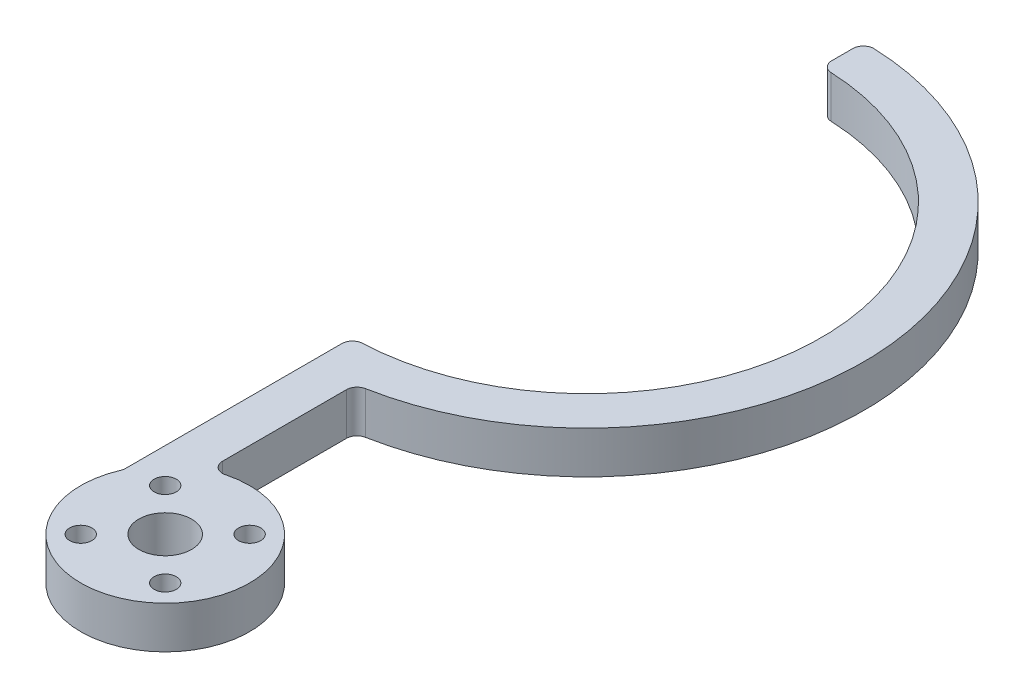
ISO-10303-21;
HEADER;
FILE_DESCRIPTION(('STEP AP214'),'2;1');
FILE_NAME('part.step','',(''),(''),'','','');
FILE_SCHEMA(('AUTOMOTIVE_DESIGN { 1 0 10303 214 1 1 1 1 }'));
ENDSEC;
DATA;
#1=APPLICATION_CONTEXT('core data for automotive mechanical design processes');
#2=APPLICATION_PROTOCOL_DEFINITION('international standard','automotive_design',2000,#1);
#3=PRODUCT_CONTEXT('',#1,'mechanical');
#4=PRODUCT('Part','Part','',(#3));
#5=PRODUCT_RELATED_PRODUCT_CATEGORY('part','',(#4));
#6=PRODUCT_DEFINITION_FORMATION('','',#4);
#7=PRODUCT_DEFINITION_CONTEXT('part definition',#1,'design');
#8=PRODUCT_DEFINITION('design','',#6,#7);
#9=PRODUCT_DEFINITION_SHAPE('','',#8);
#10=(LENGTH_UNIT() NAMED_UNIT(*) SI_UNIT(.MILLI.,.METRE.));
#11=(NAMED_UNIT(*) PLANE_ANGLE_UNIT() SI_UNIT($,.RADIAN.));
#12=(NAMED_UNIT(*) SI_UNIT($,.STERADIAN.) SOLID_ANGLE_UNIT());
#13=UNCERTAINTY_MEASURE_WITH_UNIT(LENGTH_MEASURE(1.E-05),#10,'distance_accuracy_value','');
#14=(GEOMETRIC_REPRESENTATION_CONTEXT(3) GLOBAL_UNCERTAINTY_ASSIGNED_CONTEXT((#13)) GLOBAL_UNIT_ASSIGNED_CONTEXT((#10,
#11,#12)) REPRESENTATION_CONTEXT('',''));
#15=CARTESIAN_POINT('',(0.,0.,0.));
#16=DIRECTION('',(0.,0.,1.));
#17=DIRECTION('',(1.,0.,0.));
#18=AXIS2_PLACEMENT_3D('',#15,#16,#17);
#19=CARTESIAN_POINT('',(0.,8.,0.));
#20=DIRECTION('',(1.,0.,0.));
#21=DIRECTION('',(0.,0.,-1.));
#22=AXIS2_PLACEMENT_3D('',#19,#20,#21);
#23=PLANE('',#22);
#24=DIRECTION('',(0.,0.,1.));
#25=VECTOR('',#24,1.);
#26=CARTESIAN_POINT('',(0.,0.,0.));
#27=LINE('',#26,#25);
#28=CARTESIAN_POINT('',(0.,0.,46.4069229749183));
#29=VERTEX_POINT('',#28);
#30=CARTESIAN_POINT('',(0.,0.,87.3746960611651));
#31=VERTEX_POINT('',#30);
#32=EDGE_CURVE('E222',#29,#31,#27,.T.);
#33=ORIENTED_EDGE('',*,*,#32,.T.);
#34=DIRECTION('',(0.,1.,0.));
#35=VECTOR('',#34,1.);
#36=CARTESIAN_POINT('',(0.,8.,87.3746960611651));
#37=LINE('',#36,#35);
#38=CARTESIAN_POINT('',(0.,8.,87.3746960611651));
#39=VERTEX_POINT('',#38);
#40=EDGE_CURVE('E168',#31,#39,#37,.T.);
#41=ORIENTED_EDGE('',*,*,#40,.T.);
#42=DIRECTION('',(0.,0.,1.));
#43=VECTOR('',#42,1.);
#44=CARTESIAN_POINT('',(0.,8.,0.));
#45=LINE('',#44,#43);
#46=CARTESIAN_POINT('',(0.,8.,46.4069229749183));
#47=VERTEX_POINT('',#46);
#48=EDGE_CURVE('E209',#47,#39,#45,.T.);
#49=ORIENTED_EDGE('',*,*,#48,.F.);
#50=DIRECTION('',(0.,1.,0.));
#51=VECTOR('',#50,1.);
#52=CARTESIAN_POINT('',(0.,0.,46.4069229749183));
#53=LINE('',#52,#51);
#54=EDGE_CURVE('E165',#47,#29,#53,.F.);
#55=ORIENTED_EDGE('',*,*,#54,.T.);
#56=EDGE_LOOP('',(#33,#41,#49,#55));
#57=FACE_BOUND('',#56,.T.);
#58=ADVANCED_FACE('F37',(#57),#23,.F.);
#59=CARTESIAN_POINT('',(14.5597646330328,8.,94.4297790017518));
#60=DIRECTION('',(0.,-1.,0.));
#61=DIRECTION('',(0.,0.,-1.));
#62=AXIS2_PLACEMENT_3D('',#59,#60,#61);
#63=CYLINDRICAL_SURFACE('',#62,16.);
#64=CARTESIAN_POINT('',(14.5597646330328,0.,94.4297790017518));
#65=DIRECTION('',(0.,1.,0.));
#66=DIRECTION('',(0.,0.,1.));
#67=AXIS2_PLACEMENT_3D('',#64,#65,#66);
#68=CIRCLE('',#67,16.);
#69=CARTESIAN_POINT('',(-0.160026151885255,0.,88.1585941656747));
#70=VERTEX_POINT('',#69);
#71=CARTESIAN_POINT('',(10.5066405147814,0.,78.9516594492335));
#72=VERTEX_POINT('',#71);
#73=EDGE_CURVE('E146',#70,#72,#68,.T.);
#74=ORIENTED_EDGE('',*,*,#73,.T.);
#75=DIRECTION('',(0.,-1.,0.));
#76=VECTOR('',#75,1.);
#77=CARTESIAN_POINT('',(10.5066405147814,8.,78.9516594492335));
#78=LINE('',#77,#76);
#79=CARTESIAN_POINT('',(10.5066405147814,8.,78.9516594492335));
#80=VERTEX_POINT('',#79);
#81=EDGE_CURVE('E163',#72,#80,#78,.F.);
#82=ORIENTED_EDGE('',*,*,#81,.T.);
#83=CARTESIAN_POINT('',(14.5597646330328,8.,94.4297790017518));
#84=DIRECTION('',(0.,1.,0.));
#85=DIRECTION('',(0.,0.,1.));
#86=AXIS2_PLACEMENT_3D('',#83,#84,#85);
#87=CIRCLE('',#86,16.);
#88=CARTESIAN_POINT('',(-0.160026151885255,8.,88.1585941656747));
#89=VERTEX_POINT('',#88);
#90=EDGE_CURVE('E206',#89,#80,#87,.T.);
#91=ORIENTED_EDGE('',*,*,#90,.F.);
#92=DIRECTION('',(0.,-1.,0.));
#93=VECTOR('',#92,1.);
#94=CARTESIAN_POINT('',(-0.160026151885258,8.,88.1585941656747));
#95=LINE('',#94,#93);
#96=EDGE_CURVE('E152',#89,#70,#95,.T.);
#97=ORIENTED_EDGE('',*,*,#96,.T.);
#98=EDGE_LOOP('',(#74,#82,#91,#97));
#99=FACE_BOUND('',#98,.T.);
#100=ADVANCED_FACE('F215',(#99),#63,.T.);
#101=CARTESIAN_POINT('',(8.,8.,0.));
#102=DIRECTION('',(1.,0.,0.));
#103=DIRECTION('',(0.,0.,-1.));
#104=AXIS2_PLACEMENT_3D('',#101,#102,#103);
#105=PLANE('',#104);
#106=DIRECTION('',(0.,0.,1.));
#107=VECTOR('',#106,1.);
#108=CARTESIAN_POINT('',(8.,8.,0.));
#109=LINE('',#108,#107);
#110=CARTESIAN_POINT('',(8.,8.,53.5238498241672));
#111=VERTEX_POINT('',#110);
#112=CARTESIAN_POINT('',(8.00000000000001,8.,77.0168945051687));
#113=VERTEX_POINT('',#112);
#114=EDGE_CURVE('E218',#111,#113,#109,.T.);
#115=ORIENTED_EDGE('',*,*,#114,.T.);
#116=DIRECTION('',(0.,-1.,0.));
#117=VECTOR('',#116,1.);
#118=CARTESIAN_POINT('',(8.00000000000001,8.,77.0168945051687));
#119=LINE('',#118,#117);
#120=CARTESIAN_POINT('',(8.00000000000001,0.,77.0168945051687));
#121=VERTEX_POINT('',#120);
#122=EDGE_CURVE('E145',#113,#121,#119,.T.);
#123=ORIENTED_EDGE('',*,*,#122,.T.);
#124=DIRECTION('',(0.,0.,1.));
#125=VECTOR('',#124,1.);
#126=CARTESIAN_POINT('',(8.,0.,0.));
#127=LINE('',#126,#125);
#128=CARTESIAN_POINT('',(8.,0.,53.5238498241672));
#129=VERTEX_POINT('',#128);
#130=EDGE_CURVE('E130',#129,#121,#127,.T.);
#131=ORIENTED_EDGE('',*,*,#130,.F.);
#132=DIRECTION('',(0.,-1.,0.));
#133=VECTOR('',#132,1.);
#134=CARTESIAN_POINT('',(8.,8.,53.5238498241672));
#135=LINE('',#134,#133);
#136=EDGE_CURVE('E142',#129,#111,#135,.F.);
#137=ORIENTED_EDGE('',*,*,#136,.T.);
#138=EDGE_LOOP('',(#115,#123,#131,#137));
#139=FACE_BOUND('',#138,.T.);
#140=ADVANCED_FACE('F141',(#139),#105,.T.);
#141=CARTESIAN_POINT('',(0.,8.,0.));
#142=DIRECTION('',(0.,-1.,0.));
#143=DIRECTION('',(0.,0.,-1.));
#144=AXIS2_PLACEMENT_3D('',#141,#142,#143);
#145=CYLINDRICAL_SURFACE('',#144,52.45);
#146=CARTESIAN_POINT('',(0.,8.,0.));
#147=DIRECTION('',(0.,1.,0.));
#148=DIRECTION('',(0.,0.,1.));
#149=AXIS2_PLACEMENT_3D('',#146,#147,#148);
#150=CIRCLE('',#149,52.45);
#151=CARTESIAN_POINT('',(9.63269054178145,8.,51.5578681960986));
#152=VERTEX_POINT('',#151);
#153=CARTESIAN_POINT('',(2.07928642220012,8.,-52.4087689988465));
#154=VERTEX_POINT('',#153);
#155=EDGE_CURVE('E257',#152,#154,#150,.T.);
#156=ORIENTED_EDGE('',*,*,#155,.F.);
#157=DIRECTION('',(0.,-1.,0.));
#158=VECTOR('',#157,1.);
#159=CARTESIAN_POINT('',(9.63269054178145,8.,51.5578681960986));
#160=LINE('',#159,#158);
#161=CARTESIAN_POINT('',(9.63269054178145,0.,51.5578681960986));
#162=VERTEX_POINT('',#161);
#163=EDGE_CURVE('E188',#152,#162,#160,.T.);
#164=ORIENTED_EDGE('',*,*,#163,.T.);
#165=CARTESIAN_POINT('',(0.,0.,0.));
#166=DIRECTION('',(0.,1.,0.));
#167=DIRECTION('',(0.,0.,1.));
#168=AXIS2_PLACEMENT_3D('',#165,#166,#167);
#169=CIRCLE('',#168,52.45);
#170=CARTESIAN_POINT('',(2.07928642220012,0.,-52.4087689988465));
#171=VERTEX_POINT('',#170);
#172=EDGE_CURVE('E132',#162,#171,#169,.T.);
#173=ORIENTED_EDGE('',*,*,#172,.T.);
#174=DIRECTION('',(0.,-1.,0.));
#175=VECTOR('',#174,1.);
#176=CARTESIAN_POINT('',(2.07928642220012,8.,-52.4087689988465));
#177=LINE('',#176,#175);
#178=EDGE_CURVE('E186',#171,#154,#177,.F.);
#179=ORIENTED_EDGE('',*,*,#178,.T.);
#180=EDGE_LOOP('',(#156,#164,#173,#179));
#181=FACE_BOUND('',#180,.T.);
#182=ADVANCED_FACE('F298',(#181),#145,.T.);
#183=CARTESIAN_POINT('',(0.,8.,0.));
#184=DIRECTION('',(1.,0.,0.));
#185=DIRECTION('',(0.,0.,-1.));
#186=AXIS2_PLACEMENT_3D('',#183,#184,#185);
#187=PLANE('',#186);
#188=DIRECTION('',(0.,0.,1.));
#189=VECTOR('',#188,1.);
#190=CARTESIAN_POINT('',(0.,0.,0.));
#191=LINE('',#190,#189);
#192=CARTESIAN_POINT('',(0.,0.,-50.4103412009877));
#193=VERTEX_POINT('',#192);
#194=CARTESIAN_POINT('',(0.,0.,-46.4069229749183));
#195=VERTEX_POINT('',#194);
#196=EDGE_CURVE('E233',#193,#195,#191,.T.);
#197=ORIENTED_EDGE('',*,*,#196,.T.);
#198=DIRECTION('',(0.,1.,0.));
#199=VECTOR('',#198,1.);
#200=CARTESIAN_POINT('',(0.,8.,-46.4069229749183));
#201=LINE('',#200,#199);
#202=CARTESIAN_POINT('',(0.,8.,-46.4069229749183));
#203=VERTEX_POINT('',#202);
#204=EDGE_CURVE('E52',#195,#203,#201,.T.);
#205=ORIENTED_EDGE('',*,*,#204,.T.);
#206=DIRECTION('',(0.,0.,1.));
#207=VECTOR('',#206,1.);
#208=CARTESIAN_POINT('',(0.,8.,0.));
#209=LINE('',#208,#207);
#210=CARTESIAN_POINT('',(0.,8.,-50.4103412009877));
#211=VERTEX_POINT('',#210);
#212=EDGE_CURVE('E155',#211,#203,#209,.T.);
#213=ORIENTED_EDGE('',*,*,#212,.F.);
#214=DIRECTION('',(0.,-1.,0.));
#215=VECTOR('',#214,1.);
#216=CARTESIAN_POINT('',(0.,8.,-50.4103412009877));
#217=LINE('',#216,#215);
#218=EDGE_CURVE('E190',#211,#193,#217,.T.);
#219=ORIENTED_EDGE('',*,*,#218,.T.);
#220=EDGE_LOOP('',(#197,#205,#213,#219));
#221=FACE_BOUND('',#220,.T.);
#222=ADVANCED_FACE('F286',(#221),#187,.F.);
#223=CARTESIAN_POINT('',(22.5597646330328,8.,86.4297790017518));
#224=DIRECTION('',(0.,-1.,0.));
#225=DIRECTION('',(0.,0.,-1.));
#226=AXIS2_PLACEMENT_3D('',#223,#224,#225);
#227=CYLINDRICAL_SURFACE('',#226,2.1);
#228=CARTESIAN_POINT('',(22.5597646330328,8.,86.4297790017518));
#229=DIRECTION('',(0.,1.,0.));
#230=DIRECTION('',(0.,0.,1.));
#231=AXIS2_PLACEMENT_3D('',#228,#229,#230);
#232=CIRCLE('',#231,2.1);
#233=CARTESIAN_POINT('',(22.5597646330328,8.,88.5297790017517));
#234=VERTEX_POINT('',#233);
#235=EDGE_CURVE('E252',#234,#234,#232,.T.);
#236=ORIENTED_EDGE('',*,*,#235,.T.);
#237=EDGE_LOOP('',(#236));
#238=FACE_BOUND('',#237,.T.);
#239=CARTESIAN_POINT('',(22.5597646330328,0.,86.4297790017518));
#240=DIRECTION('',(0.,1.,0.));
#241=DIRECTION('',(0.,0.,1.));
#242=AXIS2_PLACEMENT_3D('',#239,#240,#241);
#243=CIRCLE('',#242,2.1);
#244=CARTESIAN_POINT('',(22.5597646330328,0.,88.5297790017517));
#245=VERTEX_POINT('',#244);
#246=EDGE_CURVE('E225',#245,#245,#243,.T.);
#247=ORIENTED_EDGE('',*,*,#246,.F.);
#248=EDGE_LOOP('',(#247));
#249=FACE_BOUND('',#248,.T.);
#250=ADVANCED_FACE('F276',(#238,#249),#227,.F.);
#251=CARTESIAN_POINT('',(22.5597646330328,8.,102.429779001752));
#252=DIRECTION('',(0.,-1.,0.));
#253=DIRECTION('',(0.,0.,-1.));
#254=AXIS2_PLACEMENT_3D('',#251,#252,#253);
#255=CYLINDRICAL_SURFACE('',#254,2.1);
#256=CARTESIAN_POINT('',(22.5597646330328,8.,102.429779001752));
#257=DIRECTION('',(0.,1.,0.));
#258=DIRECTION('',(0.,0.,1.));
#259=AXIS2_PLACEMENT_3D('',#256,#257,#258);
#260=CIRCLE('',#259,2.1);
#261=CARTESIAN_POINT('',(22.5597646330328,8.,104.529779001752));
#262=VERTEX_POINT('',#261);
#263=EDGE_CURVE('E249',#262,#262,#260,.T.);
#264=ORIENTED_EDGE('',*,*,#263,.T.);
#265=EDGE_LOOP('',(#264));
#266=FACE_BOUND('',#265,.T.);
#267=CARTESIAN_POINT('',(22.5597646330328,0.,102.429779001752));
#268=DIRECTION('',(0.,1.,0.));
#269=DIRECTION('',(0.,0.,1.));
#270=AXIS2_PLACEMENT_3D('',#267,#268,#269);
#271=CIRCLE('',#270,2.1);
#272=CARTESIAN_POINT('',(22.5597646330328,0.,104.529779001752));
#273=VERTEX_POINT('',#272);
#274=EDGE_CURVE('E229',#273,#273,#271,.T.);
#275=ORIENTED_EDGE('',*,*,#274,.F.);
#276=EDGE_LOOP('',(#275));
#277=FACE_BOUND('',#276,.T.);
#278=ADVANCED_FACE('F273',(#266,#277),#255,.F.);
#279=CARTESIAN_POINT('',(6.55976463303277,8.,102.429779001752));
#280=DIRECTION('',(0.,-1.,0.));
#281=DIRECTION('',(0.,0.,-1.));
#282=AXIS2_PLACEMENT_3D('',#279,#280,#281);
#283=CYLINDRICAL_SURFACE('',#282,2.1);
#284=CARTESIAN_POINT('',(6.55976463303277,8.,102.429779001752));
#285=DIRECTION('',(0.,1.,0.));
#286=DIRECTION('',(0.,0.,1.));
#287=AXIS2_PLACEMENT_3D('',#284,#285,#286);
#288=CIRCLE('',#287,2.1);
#289=CARTESIAN_POINT('',(6.55976463303277,8.,104.529779001752));
#290=VERTEX_POINT('',#289);
#291=EDGE_CURVE('E244',#290,#290,#288,.T.);
#292=ORIENTED_EDGE('',*,*,#291,.T.);
#293=EDGE_LOOP('',(#292));
#294=FACE_BOUND('',#293,.T.);
#295=CARTESIAN_POINT('',(6.55976463303277,0.,102.429779001752));
#296=DIRECTION('',(0.,1.,0.));
#297=DIRECTION('',(0.,0.,1.));
#298=AXIS2_PLACEMENT_3D('',#295,#296,#297);
#299=CIRCLE('',#298,2.1);
#300=CARTESIAN_POINT('',(6.55976463303277,0.,104.529779001752));
#301=VERTEX_POINT('',#300);
#302=EDGE_CURVE('E266',#301,#301,#299,.T.);
#303=ORIENTED_EDGE('',*,*,#302,.F.);
#304=EDGE_LOOP('',(#303));
#305=FACE_BOUND('',#304,.T.);
#306=ADVANCED_FACE('F275',(#294,#305),#283,.F.);
#307=CARTESIAN_POINT('',(6.55976463303277,8.,86.4297790017518));
#308=DIRECTION('',(0.,-1.,0.));
#309=DIRECTION('',(0.,0.,-1.));
#310=AXIS2_PLACEMENT_3D('',#307,#308,#309);
#311=CYLINDRICAL_SURFACE('',#310,2.1);
#312=CARTESIAN_POINT('',(6.55976463303277,8.,86.4297790017518));
#313=DIRECTION('',(0.,1.,0.));
#314=DIRECTION('',(0.,0.,1.));
#315=AXIS2_PLACEMENT_3D('',#312,#313,#314);
#316=CIRCLE('',#315,2.1);
#317=CARTESIAN_POINT('',(6.55976463303277,8.,88.5297790017517));
#318=VERTEX_POINT('',#317);
#319=EDGE_CURVE('E239',#318,#318,#316,.T.);
#320=ORIENTED_EDGE('',*,*,#319,.T.);
#321=EDGE_LOOP('',(#320));
#322=FACE_BOUND('',#321,.T.);
#323=CARTESIAN_POINT('',(6.55976463303277,0.,86.4297790017518));
#324=DIRECTION('',(0.,1.,0.));
#325=DIRECTION('',(0.,0.,1.));
#326=AXIS2_PLACEMENT_3D('',#323,#324,#325);
#327=CIRCLE('',#326,2.1);
#328=CARTESIAN_POINT('',(6.55976463303277,0.,88.5297790017517));
#329=VERTEX_POINT('',#328);
#330=EDGE_CURVE('E263',#329,#329,#327,.T.);
#331=ORIENTED_EDGE('',*,*,#330,.F.);
#332=EDGE_LOOP('',(#331));
#333=FACE_BOUND('',#332,.T.);
#334=ADVANCED_FACE('F283',(#322,#333),#311,.F.);
#335=CARTESIAN_POINT('',(14.5597646330328,8.,94.4297790017518));
#336=DIRECTION('',(0.,-1.,0.));
#337=DIRECTION('',(0.,0.,-1.));
#338=AXIS2_PLACEMENT_3D('',#335,#336,#337);
#339=CYLINDRICAL_SURFACE('',#338,5.);
#340=CARTESIAN_POINT('',(14.5597646330328,8.,94.4297790017518));
#341=DIRECTION('',(0.,1.,0.));
#342=DIRECTION('',(0.,0.,1.));
#343=AXIS2_PLACEMENT_3D('',#340,#341,#342);
#344=CIRCLE('',#343,5.);
#345=CARTESIAN_POINT('',(14.5597646330328,8.,99.4297790017518));
#346=VERTEX_POINT('',#345);
#347=EDGE_CURVE('E236',#346,#346,#344,.T.);
#348=ORIENTED_EDGE('',*,*,#347,.T.);
#349=EDGE_LOOP('',(#348));
#350=FACE_BOUND('',#349,.T.);
#351=CARTESIAN_POINT('',(14.5597646330328,0.,94.4297790017518));
#352=DIRECTION('',(0.,1.,0.));
#353=DIRECTION('',(0.,0.,1.));
#354=AXIS2_PLACEMENT_3D('',#351,#352,#353);
#355=CIRCLE('',#354,5.);
#356=CARTESIAN_POINT('',(14.5597646330328,0.,99.4297790017518));
#357=VERTEX_POINT('',#356);
#358=EDGE_CURVE('E260',#357,#357,#355,.T.);
#359=ORIENTED_EDGE('',*,*,#358,.F.);
#360=EDGE_LOOP('',(#359));
#361=FACE_BOUND('',#360,.T.);
#362=ADVANCED_FACE('F307',(#350,#361),#339,.F.);
#363=CARTESIAN_POINT('',(0.,8.,0.));
#364=DIRECTION('',(0.,-1.,0.));
#365=DIRECTION('',(0.,0.,-1.));
#366=AXIS2_PLACEMENT_3D('',#363,#364,#365);
#367=CYLINDRICAL_SURFACE('',#366,44.45);
#368=CARTESIAN_POINT('',(0.,0.,0.));
#369=DIRECTION('',(0.,1.,0.));
#370=DIRECTION('',(0.,0.,1.));
#371=AXIS2_PLACEMENT_3D('',#368,#369,#370);
#372=CIRCLE('',#371,44.45);
#373=CARTESIAN_POINT('',(1.91388589881593,0.,44.4087777445666));
#374=VERTEX_POINT('',#373);
#375=CARTESIAN_POINT('',(1.91388589881587,0.,-44.4087777445666));
#376=VERTEX_POINT('',#375);
#377=EDGE_CURVE('E158',#374,#376,#372,.T.);
#378=ORIENTED_EDGE('',*,*,#377,.F.);
#379=DIRECTION('',(0.,-1.,0.));
#380=VECTOR('',#379,1.);
#381=CARTESIAN_POINT('',(1.91388589881593,8.,44.4087777445666));
#382=LINE('',#381,#380);
#383=CARTESIAN_POINT('',(1.91388589881593,8.,44.4087777445666));
#384=VERTEX_POINT('',#383);
#385=EDGE_CURVE('E179',#374,#384,#382,.F.);
#386=ORIENTED_EDGE('',*,*,#385,.T.);
#387=CARTESIAN_POINT('',(0.,8.,0.));
#388=DIRECTION('',(0.,1.,0.));
#389=DIRECTION('',(0.,0.,1.));
#390=AXIS2_PLACEMENT_3D('',#387,#388,#389);
#391=CIRCLE('',#390,44.45);
#392=CARTESIAN_POINT('',(1.91388589881587,8.,-44.4087777445666));
#393=VERTEX_POINT('',#392);
#394=EDGE_CURVE('E150',#384,#393,#391,.T.);
#395=ORIENTED_EDGE('',*,*,#394,.T.);
#396=DIRECTION('',(0.,-1.,0.));
#397=VECTOR('',#396,1.);
#398=CARTESIAN_POINT('',(1.91388589881586,8.,-44.4087777445666));
#399=LINE('',#398,#397);
#400=EDGE_CURVE('E176',#393,#376,#399,.T.);
#401=ORIENTED_EDGE('',*,*,#400,.T.);
#402=EDGE_LOOP('',(#378,#386,#395,#401));
#403=FACE_BOUND('',#402,.T.);
#404=ADVANCED_FACE('F304',(#403),#367,.F.);
#405=CARTESIAN_POINT('',(0.,8.,0.));
#406=DIRECTION('',(0.,1.,0.));
#407=DIRECTION('',(0.,0.,1.));
#408=AXIS2_PLACEMENT_3D('',#405,#406,#407);
#409=PLANE('',#408);
#410=ORIENTED_EDGE('',*,*,#347,.F.);
#411=EDGE_LOOP('',(#410));
#412=FACE_BOUND('',#411,.T.);
#413=ORIENTED_EDGE('',*,*,#319,.F.);
#414=EDGE_LOOP('',(#413));
#415=FACE_BOUND('',#414,.T.);
#416=ORIENTED_EDGE('',*,*,#291,.F.);
#417=EDGE_LOOP('',(#416));
#418=FACE_BOUND('',#417,.T.);
#419=ORIENTED_EDGE('',*,*,#263,.F.);
#420=EDGE_LOOP('',(#419));
#421=FACE_BOUND('',#420,.T.);
#422=ORIENTED_EDGE('',*,*,#235,.F.);
#423=EDGE_LOOP('',(#422));
#424=FACE_BOUND('',#423,.T.);
#425=ORIENTED_EDGE('',*,*,#394,.F.);
#426=CARTESIAN_POINT('',(2.,8.,46.4069229749183));
#427=DIRECTION('',(0.,1.,0.));
#428=DIRECTION('',(0.,0.,1.));
#429=AXIS2_PLACEMENT_3D('',#426,#427,#428);
#430=CIRCLE('',#429,2.);
#431=EDGE_CURVE('E184',#384,#47,#430,.T.);
#432=ORIENTED_EDGE('',*,*,#431,.T.);
#433=ORIENTED_EDGE('',*,*,#48,.T.);
#434=CARTESIAN_POINT('',(-2.00000000000001,8.,87.3746960611651));
#435=DIRECTION('',(0.,1.,0.));
#436=DIRECTION('',(0.,0.,1.));
#437=AXIS2_PLACEMENT_3D('',#434,#435,#436);
#438=CIRCLE('',#437,2.);
#439=EDGE_CURVE('E137',#39,#89,#438,.F.);
#440=ORIENTED_EDGE('',*,*,#439,.T.);
#441=ORIENTED_EDGE('',*,*,#90,.T.);
#442=CARTESIAN_POINT('',(10.,8.,77.0168945051687));
#443=DIRECTION('',(0.,1.,0.));
#444=DIRECTION('',(0.,0.,1.));
#445=AXIS2_PLACEMENT_3D('',#442,#443,#444);
#446=CIRCLE('',#445,2.);
#447=EDGE_CURVE('E196',#80,#113,#446,.F.);
#448=ORIENTED_EDGE('',*,*,#447,.T.);
#449=ORIENTED_EDGE('',*,*,#114,.F.);
#450=CARTESIAN_POINT('',(10.,8.,53.5238498241672));
#451=DIRECTION('',(0.,1.,0.));
#452=DIRECTION('',(0.,0.,1.));
#453=AXIS2_PLACEMENT_3D('',#450,#451,#452);
#454=CIRCLE('',#453,2.);
#455=EDGE_CURVE('E11',#111,#152,#454,.F.);
#456=ORIENTED_EDGE('',*,*,#455,.T.);
#457=ORIENTED_EDGE('',*,*,#155,.T.);
#458=CARTESIAN_POINT('',(1.99999999999993,8.,-50.4103412009877));
#459=DIRECTION('',(0.,1.,0.));
#460=DIRECTION('',(0.,0.,1.));
#461=AXIS2_PLACEMENT_3D('',#458,#459,#460);
#462=CIRCLE('',#461,2.);
#463=EDGE_CURVE('E59',#154,#211,#462,.T.);
#464=ORIENTED_EDGE('',*,*,#463,.T.);
#465=ORIENTED_EDGE('',*,*,#212,.T.);
#466=CARTESIAN_POINT('',(1.99999999999993,8.,-46.4069229749183));
#467=DIRECTION('',(0.,1.,0.));
#468=DIRECTION('',(0.,0.,1.));
#469=AXIS2_PLACEMENT_3D('',#466,#467,#468);
#470=CIRCLE('',#469,2.);
#471=EDGE_CURVE('E182',#203,#393,#470,.T.);
#472=ORIENTED_EDGE('',*,*,#471,.T.);
#473=EDGE_LOOP('',(#425,#432,#433,#440,#441,#448,#449,#456,#457,#464,#465,#472));
#474=FACE_BOUND('',#473,.T.);
#475=ADVANCED_FACE('F205',(#412,#415,#418,#421,#424,#474),#409,.T.);
#476=CARTESIAN_POINT('',(0.,0.,0.));
#477=DIRECTION('',(0.,1.,0.));
#478=DIRECTION('',(0.,0.,1.));
#479=AXIS2_PLACEMENT_3D('',#476,#477,#478);
#480=PLANE('',#479);
#481=ORIENTED_EDGE('',*,*,#358,.T.);
#482=EDGE_LOOP('',(#481));
#483=FACE_BOUND('',#482,.T.);
#484=ORIENTED_EDGE('',*,*,#330,.T.);
#485=EDGE_LOOP('',(#484));
#486=FACE_BOUND('',#485,.T.);
#487=ORIENTED_EDGE('',*,*,#302,.T.);
#488=EDGE_LOOP('',(#487));
#489=FACE_BOUND('',#488,.T.);
#490=ORIENTED_EDGE('',*,*,#274,.T.);
#491=EDGE_LOOP('',(#490));
#492=FACE_BOUND('',#491,.T.);
#493=ORIENTED_EDGE('',*,*,#246,.T.);
#494=EDGE_LOOP('',(#493));
#495=FACE_BOUND('',#494,.T.);
#496=ORIENTED_EDGE('',*,*,#32,.F.);
#497=CARTESIAN_POINT('',(2.,0.,46.4069229749183));
#498=DIRECTION('',(0.,1.,0.));
#499=DIRECTION('',(0.,0.,1.));
#500=AXIS2_PLACEMENT_3D('',#497,#498,#499);
#501=CIRCLE('',#500,2.);
#502=EDGE_CURVE('E174',#29,#374,#501,.F.);
#503=ORIENTED_EDGE('',*,*,#502,.T.);
#504=ORIENTED_EDGE('',*,*,#377,.T.);
#505=CARTESIAN_POINT('',(1.99999999999993,0.,-46.4069229749183));
#506=DIRECTION('',(0.,1.,0.));
#507=DIRECTION('',(0.,0.,1.));
#508=AXIS2_PLACEMENT_3D('',#505,#506,#507);
#509=CIRCLE('',#508,2.);
#510=EDGE_CURVE('E172',#376,#195,#509,.F.);
#511=ORIENTED_EDGE('',*,*,#510,.T.);
#512=ORIENTED_EDGE('',*,*,#196,.F.);
#513=CARTESIAN_POINT('',(1.99999999999993,0.,-50.4103412009877));
#514=DIRECTION('',(0.,1.,0.));
#515=DIRECTION('',(0.,0.,1.));
#516=AXIS2_PLACEMENT_3D('',#513,#514,#515);
#517=CIRCLE('',#516,2.);
#518=EDGE_CURVE('E170',#193,#171,#517,.F.);
#519=ORIENTED_EDGE('',*,*,#518,.T.);
#520=ORIENTED_EDGE('',*,*,#172,.F.);
#521=CARTESIAN_POINT('',(10.,0.,53.5238498241672));
#522=DIRECTION('',(0.,1.,0.));
#523=DIRECTION('',(0.,0.,1.));
#524=AXIS2_PLACEMENT_3D('',#521,#522,#523);
#525=CIRCLE('',#524,2.);
#526=EDGE_CURVE('E45',#162,#129,#525,.T.);
#527=ORIENTED_EDGE('',*,*,#526,.T.);
#528=ORIENTED_EDGE('',*,*,#130,.T.);
#529=CARTESIAN_POINT('',(10.,0.,77.0168945051687));
#530=DIRECTION('',(0.,1.,0.));
#531=DIRECTION('',(0.,0.,1.));
#532=AXIS2_PLACEMENT_3D('',#529,#530,#531);
#533=CIRCLE('',#532,2.);
#534=EDGE_CURVE('E194',#121,#72,#533,.T.);
#535=ORIENTED_EDGE('',*,*,#534,.T.);
#536=ORIENTED_EDGE('',*,*,#73,.F.);
#537=CARTESIAN_POINT('',(-2.00000000000001,0.,87.3746960611651));
#538=DIRECTION('',(0.,1.,0.));
#539=DIRECTION('',(0.,0.,1.));
#540=AXIS2_PLACEMENT_3D('',#537,#538,#539);
#541=CIRCLE('',#540,2.);
#542=EDGE_CURVE('E198',#70,#31,#541,.T.);
#543=ORIENTED_EDGE('',*,*,#542,.T.);
#544=EDGE_LOOP('',(#496,#503,#504,#511,#512,#519,#520,#527,#528,#535,#536,#543));
#545=FACE_BOUND('',#544,.T.);
#546=ADVANCED_FACE('F129',(#483,#486,#489,#492,#495,#545),#480,.F.);
#547=CARTESIAN_POINT('',(10.,8.,77.0168945051687));
#548=DIRECTION('',(0.,-1.,0.));
#549=DIRECTION('',(0.,0.,-1.));
#550=AXIS2_PLACEMENT_3D('',#547,#548,#549);
#551=CYLINDRICAL_SURFACE('',#550,2.);
#552=ORIENTED_EDGE('',*,*,#447,.F.);
#553=ORIENTED_EDGE('',*,*,#81,.F.);
#554=ORIENTED_EDGE('',*,*,#534,.F.);
#555=ORIENTED_EDGE('',*,*,#122,.F.);
#556=EDGE_LOOP('',(#552,#553,#554,#555));
#557=FACE_BOUND('',#556,.T.);
#558=ADVANCED_FACE('F311',(#557),#551,.F.);
#559=CARTESIAN_POINT('',(-2.00000000000001,8.,87.3746960611651));
#560=DIRECTION('',(0.,-1.,0.));
#561=DIRECTION('',(0.,0.,-1.));
#562=AXIS2_PLACEMENT_3D('',#559,#560,#561);
#563=CYLINDRICAL_SURFACE('',#562,2.);
#564=ORIENTED_EDGE('',*,*,#439,.F.);
#565=ORIENTED_EDGE('',*,*,#40,.F.);
#566=ORIENTED_EDGE('',*,*,#542,.F.);
#567=ORIENTED_EDGE('',*,*,#96,.F.);
#568=EDGE_LOOP('',(#564,#565,#566,#567));
#569=FACE_BOUND('',#568,.T.);
#570=ADVANCED_FACE('F220',(#569),#563,.F.);
#571=CARTESIAN_POINT('',(2.,8.,46.4069229749183));
#572=DIRECTION('',(0.,-1.,0.));
#573=DIRECTION('',(0.,0.,-1.));
#574=AXIS2_PLACEMENT_3D('',#571,#572,#573);
#575=CYLINDRICAL_SURFACE('',#574,2.);
#576=ORIENTED_EDGE('',*,*,#431,.F.);
#577=ORIENTED_EDGE('',*,*,#385,.F.);
#578=ORIENTED_EDGE('',*,*,#502,.F.);
#579=ORIENTED_EDGE('',*,*,#54,.F.);
#580=EDGE_LOOP('',(#576,#577,#578,#579));
#581=FACE_BOUND('',#580,.T.);
#582=ADVANCED_FACE('F346',(#581),#575,.T.);
#583=CARTESIAN_POINT('',(10.,8.,53.5238498241672));
#584=DIRECTION('',(0.,-1.,0.));
#585=DIRECTION('',(0.,0.,-1.));
#586=AXIS2_PLACEMENT_3D('',#583,#584,#585);
#587=CYLINDRICAL_SURFACE('',#586,2.);
#588=ORIENTED_EDGE('',*,*,#455,.F.);
#589=ORIENTED_EDGE('',*,*,#136,.F.);
#590=ORIENTED_EDGE('',*,*,#526,.F.);
#591=ORIENTED_EDGE('',*,*,#163,.F.);
#592=EDGE_LOOP('',(#588,#589,#590,#591));
#593=FACE_BOUND('',#592,.T.);
#594=ADVANCED_FACE('F149',(#593),#587,.F.);
#595=CARTESIAN_POINT('',(1.99999999999993,8.,-46.4069229749183));
#596=DIRECTION('',(0.,-1.,0.));
#597=DIRECTION('',(0.,0.,-1.));
#598=AXIS2_PLACEMENT_3D('',#595,#596,#597);
#599=CYLINDRICAL_SURFACE('',#598,2.);
#600=ORIENTED_EDGE('',*,*,#471,.F.);
#601=ORIENTED_EDGE('',*,*,#204,.F.);
#602=ORIENTED_EDGE('',*,*,#510,.F.);
#603=ORIENTED_EDGE('',*,*,#400,.F.);
#604=EDGE_LOOP('',(#600,#601,#602,#603));
#605=FACE_BOUND('',#604,.T.);
#606=ADVANCED_FACE('F351',(#605),#599,.T.);
#607=CARTESIAN_POINT('',(1.99999999999993,8.,-50.4103412009877));
#608=DIRECTION('',(0.,-1.,0.));
#609=DIRECTION('',(0.,0.,-1.));
#610=AXIS2_PLACEMENT_3D('',#607,#608,#609);
#611=CYLINDRICAL_SURFACE('',#610,2.);
#612=ORIENTED_EDGE('',*,*,#463,.F.);
#613=ORIENTED_EDGE('',*,*,#178,.F.);
#614=ORIENTED_EDGE('',*,*,#518,.F.);
#615=ORIENTED_EDGE('',*,*,#218,.F.);
#616=EDGE_LOOP('',(#612,#613,#614,#615));
#617=FACE_BOUND('',#616,.T.);
#618=ADVANCED_FACE('F39',(#617),#611,.T.);
#619=CLOSED_SHELL('',(#58,#100,#140,#182,#222,#250,#278,#306,#334,#362,#404,#475,#546,#558,#570,
#582,#594,#606,#618));
#620=MANIFOLD_SOLID_BREP('B2',#619);
#621=ADVANCED_BREP_SHAPE_REPRESENTATION('',(#18,#620),#14);
#622=SHAPE_DEFINITION_REPRESENTATION(#9,#621);
ENDSEC;
END-ISO-10303-21;
